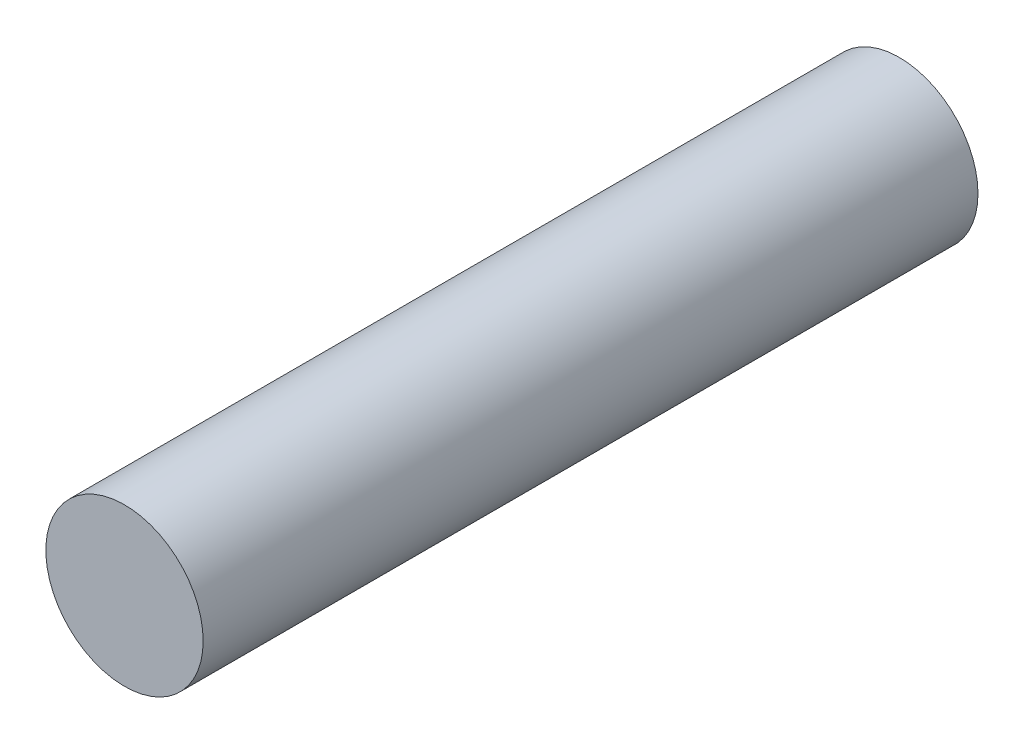
ISO-10303-21;
HEADER;
FILE_DESCRIPTION(('STEP AP214'),'2;1');
FILE_NAME('part.step','',(''),(''),'','','');
FILE_SCHEMA(('AUTOMOTIVE_DESIGN { 1 0 10303 214 1 1 1 1 }'));
ENDSEC;
DATA;
#1=APPLICATION_CONTEXT('core data for automotive mechanical design processes');
#2=APPLICATION_PROTOCOL_DEFINITION('international standard','automotive_design',2000,#1);
#3=PRODUCT_CONTEXT('',#1,'mechanical');
#4=PRODUCT('Part','Part','',(#3));
#5=PRODUCT_RELATED_PRODUCT_CATEGORY('part','',(#4));
#6=PRODUCT_DEFINITION_FORMATION('','',#4);
#7=PRODUCT_DEFINITION_CONTEXT('part definition',#1,'design');
#8=PRODUCT_DEFINITION('design','',#6,#7);
#9=PRODUCT_DEFINITION_SHAPE('','',#8);
#10=(LENGTH_UNIT() NAMED_UNIT(*) SI_UNIT(.MILLI.,.METRE.));
#11=(NAMED_UNIT(*) PLANE_ANGLE_UNIT() SI_UNIT($,.RADIAN.));
#12=(NAMED_UNIT(*) SI_UNIT($,.STERADIAN.) SOLID_ANGLE_UNIT());
#13=UNCERTAINTY_MEASURE_WITH_UNIT(LENGTH_MEASURE(1.E-05),#10,'distance_accuracy_value','');
#14=(GEOMETRIC_REPRESENTATION_CONTEXT(3) GLOBAL_UNCERTAINTY_ASSIGNED_CONTEXT((#13)) GLOBAL_UNIT_ASSIGNED_CONTEXT((#10,
#11,#12)) REPRESENTATION_CONTEXT('',''));
#15=CARTESIAN_POINT('',(0.,0.,0.));
#16=DIRECTION('',(0.,0.,1.));
#17=DIRECTION('',(1.,0.,0.));
#18=AXIS2_PLACEMENT_3D('',#15,#16,#17);
#19=CARTESIAN_POINT('',(0.,0.,9.85));
#20=DIRECTION('',(0.,0.,-1.));
#21=DIRECTION('',(-1.,0.,0.));
#22=AXIS2_PLACEMENT_3D('',#19,#20,#21);
#23=CYLINDRICAL_SURFACE('',#22,1.);
#24=CARTESIAN_POINT('',(0.,0.,9.85));
#25=DIRECTION('',(0.,0.,1.));
#26=DIRECTION('',(1.,0.,0.));
#27=AXIS2_PLACEMENT_3D('',#24,#25,#26);
#28=CIRCLE('',#27,1.);
#29=CARTESIAN_POINT('',(1.,0.,9.85));
#30=VERTEX_POINT('',#29);
#31=EDGE_CURVE('E10',#30,#30,#28,.T.);
#32=ORIENTED_EDGE('',*,*,#31,.F.);
#33=EDGE_LOOP('',(#32));
#34=FACE_BOUND('',#33,.T.);
#35=CARTESIAN_POINT('',(0.,0.,0.));
#36=DIRECTION('',(0.,0.,1.));
#37=DIRECTION('',(1.,0.,0.));
#38=AXIS2_PLACEMENT_3D('',#35,#36,#37);
#39=CIRCLE('',#38,1.);
#40=CARTESIAN_POINT('',(1.,0.,0.));
#41=VERTEX_POINT('',#40);
#42=EDGE_CURVE('E42',#41,#41,#39,.T.);
#43=ORIENTED_EDGE('',*,*,#42,.T.);
#44=EDGE_LOOP('',(#43));
#45=FACE_BOUND('',#44,.T.);
#46=ADVANCED_FACE('F39',(#34,#45),#23,.T.);
#47=CARTESIAN_POINT('',(0.,0.,9.85));
#48=DIRECTION('',(0.,0.,1.));
#49=DIRECTION('',(1.,0.,0.));
#50=AXIS2_PLACEMENT_3D('',#47,#48,#49);
#51=PLANE('',#50);
#52=ORIENTED_EDGE('',*,*,#31,.T.);
#53=EDGE_LOOP('',(#52));
#54=FACE_BOUND('',#53,.T.);
#55=ADVANCED_FACE('F54',(#54),#51,.T.);
#56=CARTESIAN_POINT('',(0.,0.,0.));
#57=DIRECTION('',(0.,0.,1.));
#58=DIRECTION('',(1.,0.,0.));
#59=AXIS2_PLACEMENT_3D('',#56,#57,#58);
#60=PLANE('',#59);
#61=ORIENTED_EDGE('',*,*,#42,.F.);
#62=EDGE_LOOP('',(#61));
#63=FACE_BOUND('',#62,.T.);
#64=ADVANCED_FACE('F52',(#63),#60,.F.);
#65=CLOSED_SHELL('',(#46,#55,#64));
#66=MANIFOLD_SOLID_BREP('B2',#65);
#67=ADVANCED_BREP_SHAPE_REPRESENTATION('',(#18,#66),#14);
#68=SHAPE_DEFINITION_REPRESENTATION(#9,#67);
ENDSEC;
END-ISO-10303-21;
